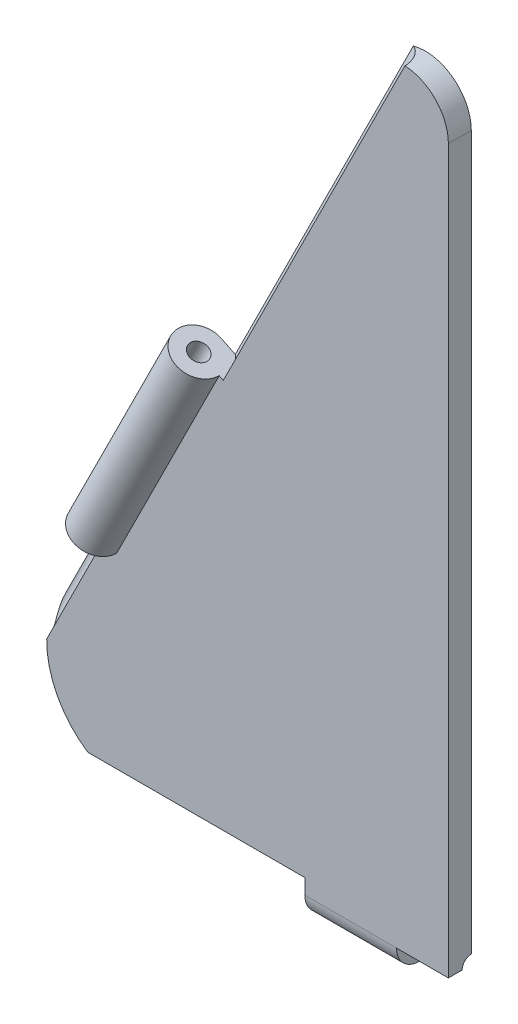
ISO-10303-21;
HEADER;
FILE_DESCRIPTION(('STEP AP214'),'2;1');
FILE_NAME('part.step','',(''),(''),'','','');
FILE_SCHEMA(('AUTOMOTIVE_DESIGN { 1 0 10303 214 1 1 1 1 }'));
ENDSEC;
DATA;
#1=APPLICATION_CONTEXT('core data for automotive mechanical design processes');
#2=APPLICATION_PROTOCOL_DEFINITION('international standard','automotive_design',2000,#1);
#3=PRODUCT_CONTEXT('',#1,'mechanical');
#4=PRODUCT('Part','Part','',(#3));
#5=PRODUCT_RELATED_PRODUCT_CATEGORY('part','',(#4));
#6=PRODUCT_DEFINITION_FORMATION('','',#4);
#7=PRODUCT_DEFINITION_CONTEXT('part definition',#1,'design');
#8=PRODUCT_DEFINITION('design','',#6,#7);
#9=PRODUCT_DEFINITION_SHAPE('','',#8);
#10=(LENGTH_UNIT() NAMED_UNIT(*) SI_UNIT(.MILLI.,.METRE.));
#11=(NAMED_UNIT(*) PLANE_ANGLE_UNIT() SI_UNIT($,.RADIAN.));
#12=(NAMED_UNIT(*) SI_UNIT($,.STERADIAN.) SOLID_ANGLE_UNIT());
#13=UNCERTAINTY_MEASURE_WITH_UNIT(LENGTH_MEASURE(1.E-05),#10,'distance_accuracy_value','');
#14=(GEOMETRIC_REPRESENTATION_CONTEXT(3) GLOBAL_UNCERTAINTY_ASSIGNED_CONTEXT((#13)) GLOBAL_UNIT_ASSIGNED_CONTEXT((#10,
#11,#12)) REPRESENTATION_CONTEXT('',''));
#15=CARTESIAN_POINT('',(0.,0.,0.));
#16=DIRECTION('',(0.,0.,1.));
#17=DIRECTION('',(1.,0.,0.));
#18=AXIS2_PLACEMENT_3D('',#15,#16,#17);
#19=CARTESIAN_POINT('',(-289.97718898323,96.6564322064938,2.5));
#20=DIRECTION('',(0.,0.,-1.));
#21=DIRECTION('',(-1.,0.,0.));
#22=AXIS2_PLACEMENT_3D('',#19,#20,#21);
#23=PLANE('',#22);
#24=DIRECTION('',(0.894427190999916,-0.447213595499958,0.));
#25=VECTOR('',#24,1.);
#26=CARTESIAN_POINT('',(-274.449324938229,127.712160296495,2.5));
#27=LINE('',#26,#25);
#28=CARTESIAN_POINT('',(-283.393596848228,132.184296251494,2.5));
#29=VERTEX_POINT('',#28);
#30=CARTESIAN_POINT('',(-281.910357150809,131.442676402785,2.5));
#31=VERTEX_POINT('',#30);
#32=EDGE_CURVE('E164',#29,#31,#27,.T.);
#33=ORIENTED_EDGE('',*,*,#32,.T.);
#34=DIRECTION('',(-0.447213595499958,-0.894427190999916,0.));
#35=VECTOR('',#34,1.);
#36=CARTESIAN_POINT('',(-261.146425128309,172.970540447785,2.5));
#37=LINE('',#36,#35);
#38=CARTESIAN_POINT('',(-262.483107723135,170.297175258133,2.5));
#39=VERTEX_POINT('',#38);
#40=EDGE_CURVE('E170',#31,#39,#37,.F.);
#41=ORIENTED_EDGE('',*,*,#40,.T.);
#42=CARTESIAN_POINT('',(-261.157528870729,165.476092318995,2.5));
#43=DIRECTION('',(0.,0.,1.));
#44=DIRECTION('',(1.,0.,0.));
#45=AXIS2_PLACEMENT_3D('',#42,#43,#44);
#46=CIRCLE('',#45,5.00000000000001);
#47=CARTESIAN_POINT('',(-256.157528870729,165.476092318995,2.5));
#48=VERTEX_POINT('',#47);
#49=EDGE_CURVE('E270',#48,#39,#46,.T.);
#50=ORIENTED_EDGE('',*,*,#49,.F.);
#51=DIRECTION('',(0.,1.,0.));
#52=VECTOR('',#51,1.);
#53=CARTESIAN_POINT('',(-256.157528870729,86.6564322064939,2.5));
#54=LINE('',#53,#52);
#55=CARTESIAN_POINT('',(-256.157528870729,87.6564322064939,2.5));
#56=VERTEX_POINT('',#55);
#57=EDGE_CURVE('E268',#56,#48,#54,.T.);
#58=ORIENTED_EDGE('',*,*,#57,.F.);
#59=DIRECTION('',(-1.,0.,0.));
#60=VECTOR('',#59,1.);
#61=CARTESIAN_POINT('',(-256.157528870729,87.6564322064939,2.5));
#62=LINE('',#61,#60);
#63=CARTESIAN_POINT('',(-261.817358926979,87.6564322064939,2.5));
#64=VERTEX_POINT('',#63);
#65=EDGE_CURVE('E184',#64,#56,#62,.F.);
#66=ORIENTED_EDGE('',*,*,#65,.F.);
#67=DIRECTION('',(0.,1.,0.));
#68=VECTOR('',#67,1.);
#69=CARTESIAN_POINT('',(-261.817358926979,96.6564322064938,2.5));
#70=LINE('',#69,#68);
#71=CARTESIAN_POINT('',(-261.817358926979,89.1564322064939,2.5));
#72=VERTEX_POINT('',#71);
#73=EDGE_CURVE('E283',#64,#72,#70,.T.);
#74=ORIENTED_EDGE('',*,*,#73,.T.);
#75=DIRECTION('',(-1.,0.,0.));
#76=VECTOR('',#75,1.);
#77=CARTESIAN_POINT('',(-271.817358926979,89.1564322064939,2.5));
#78=LINE('',#77,#76);
#79=CARTESIAN_POINT('',(-271.817358926979,89.1564322064939,2.5));
#80=VERTEX_POINT('',#79);
#81=EDGE_CURVE('E285',#72,#80,#78,.T.);
#82=ORIENTED_EDGE('',*,*,#81,.T.);
#83=DIRECTION('',(0.,1.,0.));
#84=VECTOR('',#83,1.);
#85=CARTESIAN_POINT('',(-271.817358926979,96.6564322064938,2.5));
#86=LINE('',#85,#84);
#87=CARTESIAN_POINT('',(-271.817358926979,89.6564322064939,2.5));
#88=VERTEX_POINT('',#87);
#89=EDGE_CURVE('E192',#80,#88,#86,.T.);
#90=ORIENTED_EDGE('',*,*,#89,.T.);
#91=DIRECTION('',(1.,0.,0.));
#92=VECTOR('',#91,1.);
#93=CARTESIAN_POINT('',(-299.97718898323,89.6564322064939,2.5));
#94=LINE('',#93,#92);
#95=CARTESIAN_POINT('',(-297.118617411773,89.6564322064939,2.5));
#96=VERTEX_POINT('',#95);
#97=EDGE_CURVE('E202',#88,#96,#94,.F.);
#98=ORIENTED_EDGE('',*,*,#97,.T.);
#99=CARTESIAN_POINT('',(-289.97718898323,96.6564322064938,2.5));
#100=DIRECTION('',(0.,0.,1.));
#101=DIRECTION('',(-1.,0.,0.));
#102=AXIS2_PLACEMENT_3D('',#99,#100,#101);
#103=CIRCLE('',#102,9.99999999999999);
#104=CARTESIAN_POINT('',(-298.921460893229,101.128568161494,2.5));
#105=VERTEX_POINT('',#104);
#106=EDGE_CURVE('E255',#105,#96,#103,.T.);
#107=ORIENTED_EDGE('',*,*,#106,.F.);
#108=DIRECTION('',(-0.447213595499957,-0.894427190999916,0.));
#109=VECTOR('',#108,1.);
#110=CARTESIAN_POINT('',(-265.629664825728,167.712160296494,2.5));
#111=LINE('',#110,#109);
#112=CARTESIAN_POINT('',(-294.573936735728,109.823616476496,2.5));
#113=VERTEX_POINT('',#112);
#114=EDGE_CURVE('E273',#113,#105,#111,.T.);
#115=ORIENTED_EDGE('',*,*,#114,.F.);
#116=EDGE_CURVE('E260',#29,#113,#111,.T.);
#117=ORIENTED_EDGE('',*,*,#116,.F.);
#118=EDGE_LOOP('',(#33,#41,#50,#58,#66,#74,#82,#90,#98,#107,#115,#117));
#119=FACE_BOUND('',#118,.T.);
#120=ADVANCED_FACE('F45',(#119),#23,.T.);
#121=CARTESIAN_POINT('',(-289.97718898323,96.6564322064938,5.));
#122=DIRECTION('',(0.,0.,-1.));
#123=DIRECTION('',(-1.,0.,0.));
#124=AXIS2_PLACEMENT_3D('',#121,#122,#123);
#125=PLANE('',#124);
#126=DIRECTION('',(-0.447213595499958,-0.894427190999916,0.));
#127=VECTOR('',#126,1.);
#128=CARTESIAN_POINT('',(-259.946383252728,172.370519509995,5.));
#129=LINE('',#128,#127);
#130=CARTESIAN_POINT('',(-280.710315275229,130.842655464994,5.));
#131=VERTEX_POINT('',#130);
#132=CARTESIAN_POINT('',(-260.896993099537,170.469299816379,5.));
#133=VERTEX_POINT('',#132);
#134=EDGE_CURVE('E163',#131,#133,#129,.F.);
#135=ORIENTED_EDGE('',*,*,#134,.F.);
#136=DIRECTION('',(0.894427190999916,-0.447213595499958,0.));
#137=VECTOR('',#136,1.);
#138=CARTESIAN_POINT('',(-274.449324938229,127.712160296495,5.));
#139=LINE('',#138,#137);
#140=CARTESIAN_POINT('',(-281.157528870729,131.066262262744,5.));
#141=VERTEX_POINT('',#140);
#142=EDGE_CURVE('E152',#141,#131,#139,.T.);
#143=ORIENTED_EDGE('',*,*,#142,.F.);
#144=DIRECTION('',(0.447213595499958,0.894427190999916,0.));
#145=VECTOR('',#144,1.);
#146=CARTESIAN_POINT('',(-281.157528870729,131.066262262744,5.));
#147=LINE('',#146,#145);
#148=CARTESIAN_POINT('',(-292.337868758228,108.705582487746,5.));
#149=VERTEX_POINT('',#148);
#150=EDGE_CURVE('E253',#141,#149,#147,.F.);
#151=ORIENTED_EDGE('',*,*,#150,.T.);
#152=DIRECTION('',(-0.894427190999916,0.447213595499958,0.));
#153=VECTOR('',#152,1.);
#154=CARTESIAN_POINT('',(-285.629664825728,105.351480521497,5.));
#155=LINE('',#154,#153);
#156=CARTESIAN_POINT('',(-293.679509544727,109.376402880996,5.));
#157=VERTEX_POINT('',#156);
#158=EDGE_CURVE('E248',#149,#157,#155,.T.);
#159=ORIENTED_EDGE('',*,*,#158,.T.);
#160=DIRECTION('',(-0.447213595499958,-0.894427190999916,0.));
#161=VECTOR('',#160,1.);
#162=CARTESIAN_POINT('',(-261.735237634728,173.264946700995,5.));
#163=LINE('',#162,#161);
#164=CARTESIAN_POINT('',(-299.976392571191,96.7826368280699,5.));
#165=VERTEX_POINT('',#164);
#166=EDGE_CURVE('E229',#157,#165,#163,.T.);
#167=ORIENTED_EDGE('',*,*,#166,.T.);
#168=CARTESIAN_POINT('',(-289.97718898323,96.6564322064938,5.));
#169=DIRECTION('',(0.,0.,1.));
#170=DIRECTION('',(-1.,0.,0.));
#171=AXIS2_PLACEMENT_3D('',#168,#169,#170);
#172=CIRCLE('',#171,9.99999999999999);
#173=CARTESIAN_POINT('',(-295.492281720759,88.3147446016716,5.));
#174=VERTEX_POINT('',#173);
#175=EDGE_CURVE('E256',#165,#174,#172,.T.);
#176=ORIENTED_EDGE('',*,*,#175,.T.);
#177=DIRECTION('',(1.,0.,0.));
#178=VECTOR('',#177,1.);
#179=CARTESIAN_POINT('',(-299.97718898323,88.3147446016716,5.));
#180=LINE('',#179,#178);
#181=CARTESIAN_POINT('',(-271.817358926979,88.3147446016716,5.));
#182=VERTEX_POINT('',#181);
#183=EDGE_CURVE('E291',#182,#174,#180,.F.);
#184=ORIENTED_EDGE('',*,*,#183,.F.);
#185=DIRECTION('',(0.,1.,0.));
#186=VECTOR('',#185,1.);
#187=CARTESIAN_POINT('',(-271.817358926979,96.6564322064938,5.));
#188=LINE('',#187,#186);
#189=CARTESIAN_POINT('',(-271.817358926979,86.6564322064939,5.));
#190=VERTEX_POINT('',#189);
#191=EDGE_CURVE('E190',#190,#182,#188,.T.);
#192=ORIENTED_EDGE('',*,*,#191,.F.);
#193=DIRECTION('',(-1.,0.,0.));
#194=VECTOR('',#193,1.);
#195=CARTESIAN_POINT('',(-271.817358926979,86.6564322064939,5.));
#196=LINE('',#195,#194);
#197=CARTESIAN_POINT('',(-261.817358926979,86.6564322064939,5.));
#198=VERTEX_POINT('',#197);
#199=EDGE_CURVE('E241',#190,#198,#196,.F.);
#200=ORIENTED_EDGE('',*,*,#199,.T.);
#201=DIRECTION('',(1.,0.,0.));
#202=VECTOR('',#201,1.);
#203=CARTESIAN_POINT('',(-289.97718898323,86.6564322064939,5.));
#204=LINE('',#203,#202);
#205=CARTESIAN_POINT('',(-256.157528870729,86.6564322064939,5.));
#206=VERTEX_POINT('',#205);
#207=EDGE_CURVE('E259',#198,#206,#204,.T.);
#208=ORIENTED_EDGE('',*,*,#207,.T.);
#209=DIRECTION('',(0.,1.,0.));
#210=VECTOR('',#209,1.);
#211=CARTESIAN_POINT('',(-256.157528870729,86.6564322064939,5.));
#212=LINE('',#211,#210);
#213=CARTESIAN_POINT('',(-256.157528870729,165.476092318995,5.));
#214=VERTEX_POINT('',#213);
#215=EDGE_CURVE('E262',#206,#214,#212,.T.);
#216=ORIENTED_EDGE('',*,*,#215,.T.);
#217=CARTESIAN_POINT('',(-261.157528870729,165.476092318995,5.));
#218=DIRECTION('',(0.,0.,1.));
#219=DIRECTION('',(1.,0.,0.));
#220=AXIS2_PLACEMENT_3D('',#217,#218,#219);
#221=CIRCLE('',#220,5.00000000000001);
#222=EDGE_CURVE('E175',#214,#133,#221,.T.);
#223=ORIENTED_EDGE('',*,*,#222,.T.);
#224=EDGE_LOOP('',(#135,#143,#151,#159,#167,#176,#184,#192,#200,#208,#216,#223));
#225=FACE_BOUND('',#224,.T.);
#226=ADVANCED_FACE('F173',(#225),#125,.F.);
#227=CARTESIAN_POINT('',(-261.157528870729,165.476092318995,5.));
#228=DIRECTION('',(0.,0.,-1.));
#229=DIRECTION('',(-1.,0.,0.));
#230=AXIS2_PLACEMENT_3D('',#227,#228,#229);
#231=CYLINDRICAL_SURFACE('',#230,5.00000000000001);
#232=CARTESIAN_POINT('',(-260.896993099537,170.469299816379,5.));
#233=CARTESIAN_POINT('',(-260.896988347755,170.469286635421,4.9233913880761));
#234=CARTESIAN_POINT('',(-260.900190551412,170.46946630684,4.84678521462993));
#235=CARTESIAN_POINT('',(-260.912971757577,170.47011543886,4.69410614682717));
#236=CARTESIAN_POINT('',(-260.922550910404,170.47058490629,4.61803326508406));
#237=CARTESIAN_POINT('',(-260.948051018156,170.471717800458,4.46694029175455));
#238=CARTESIAN_POINT('',(-260.963973026661,170.472381259412,4.39192037721535));
#239=CARTESIAN_POINT('',(-261.002057833009,170.473710534316,4.24350558058141));
#240=CARTESIAN_POINT('',(-261.024220441306,170.474376350194,4.17011064920393));
#241=CARTESIAN_POINT('',(-261.099962032676,170.476020678725,3.95301129216209));
#242=CARTESIAN_POINT('',(-261.162793256986,170.476645951899,3.81240133931156));
#243=CARTESIAN_POINT('',(-261.31124386419,170.474274888097,3.54402419807906));
#244=CARTESIAN_POINT('',(-261.396845362707,170.471281386889,3.41624703851447));
#245=CARTESIAN_POINT('',(-261.586719492906,170.45853323552,3.17831278954411));
#246=CARTESIAN_POINT('',(-261.690756420873,170.448859927149,3.0679631344423));
#247=CARTESIAN_POINT('',(-261.914032257995,170.419805646467,2.86541751663317));
#248=CARTESIAN_POINT('',(-262.033267284906,170.400427149586,2.77321693312596));
#249=CARTESIAN_POINT('',(-262.21022064098,170.364320157933,2.6553629856596));
#250=CARTESIAN_POINT('',(-262.263921374375,170.352466514842,2.62191188166515));
#251=CARTESIAN_POINT('',(-262.372610056761,170.326524378497,2.55843875952877));
#252=CARTESIAN_POINT('',(-262.42759458521,170.312441349644,2.52840865794112));
#253=CARTESIAN_POINT('',(-262.483107723135,170.297175258133,2.5));
#254=B_SPLINE_CURVE_WITH_KNOTS('',3,(#232,#233,#234,#235,#236,#237,#238,#239,#240,#241,#242,
#243,#244,#245,#246,#247,#248,#249,#250,#251,#252,#253),.UNSPECIFIED.,.F.,.F.,(4,2,2,2,2,2,2,2,
2,2,4),(0.,0.22975409222768,0.459513600419766,0.68931128870851,0.919101998082991,1.378710562228,
1.83795919808724,2.29171184256308,2.74534881060817,2.9383389628852,3.1308632035463),.UNSPECIFIED.);
#255=EDGE_CURVE('E12',#133,#39,#254,.T.);
#256=ORIENTED_EDGE('',*,*,#255,.F.);
#257=ORIENTED_EDGE('',*,*,#222,.F.);
#258=DIRECTION('',(0.,0.,-1.));
#259=VECTOR('',#258,1.);
#260=CARTESIAN_POINT('',(-256.157528870729,165.476092318995,5.));
#261=LINE('',#260,#259);
#262=EDGE_CURVE('E277',#214,#48,#261,.T.);
#263=ORIENTED_EDGE('',*,*,#262,.T.);
#264=ORIENTED_EDGE('',*,*,#49,.T.);
#265=EDGE_LOOP('',(#256,#257,#263,#264));
#266=FACE_BOUND('',#265,.T.);
#267=ADVANCED_FACE('F215',(#266),#231,.T.);
#268=CARTESIAN_POINT('',(-262.629664825728,173.712160296495,4.99999999999999));
#269=DIRECTION('',(-0.447213595499958,-0.894427190999916,0.));
#270=DIRECTION('',(0.894427190999916,-0.447213595499958,0.));
#271=AXIS2_PLACEMENT_3D('',#268,#269,#270);
#272=CYLINDRICAL_SURFACE('',#271,1.);
#273=CARTESIAN_POINT('',(-299.976392571191,96.7826368280699,5.));
#274=CARTESIAN_POINT('',(-299.976390483361,96.7825710563107,4.97340569328912));
#275=CARTESIAN_POINT('',(-299.976362008091,96.7850669164074,4.9468941799335));
#276=CARTESIAN_POINT('',(-299.976236556925,96.7945793833969,4.89497835142418));
#277=CARTESIAN_POINT('',(-299.976140322486,96.8015469856599,4.86956518376658));
#278=CARTESIAN_POINT('',(-299.975834151883,96.8213738311701,4.81479787758699));
#279=CARTESIAN_POINT('',(-299.975603984182,96.8351870398518,4.7857941367651));
#280=CARTESIAN_POINT('',(-299.974977503782,96.8673499883272,4.7303360167709));
#281=CARTESIAN_POINT('',(-299.974580464437,96.8857194231713,4.70389341740598));
#282=CARTESIAN_POINT('',(-299.97331333722,96.9364888657939,4.64028187448));
#283=CARTESIAN_POINT('',(-299.972303844597,96.9711413302242,4.60493070052432));
#284=CARTESIAN_POINT('',(-299.96969680239,97.0452425348733,4.53980000343431));
#285=CARTESIAN_POINT('',(-299.968098144125,97.0847002231327,4.51003114538899));
#286=CARTESIAN_POINT('',(-299.9643475153,97.1645483771898,4.45652805035983));
#287=CARTESIAN_POINT('',(-299.96222789657,97.2047888162956,4.43256358204837));
#288=CARTESIAN_POINT('',(-299.957366194407,97.2871197474709,4.38808912985786));
#289=CARTESIAN_POINT('',(-299.954623531492,97.3292119322414,4.36758239308767));
#290=CARTESIAN_POINT('',(-299.948489411164,97.4147265046999,4.32943621821867));
#291=CARTESIAN_POINT('',(-299.945096543016,97.4581516091027,4.31180317192067));
#292=CARTESIAN_POINT('',(-299.937655202848,97.5458421625752,4.27901209995677));
#293=CARTESIAN_POINT('',(-299.933606973179,97.5901072956807,4.26385316350999));
#294=CARTESIAN_POINT('',(-299.922915338052,97.6988737726317,4.22941267040974));
#295=CARTESIAN_POINT('',(-299.91591447105,97.7636962059699,4.21125838544163));
#296=CARTESIAN_POINT('',(-299.900523837879,97.8940688363546,4.17845580954913));
#297=CARTESIAN_POINT('',(-299.892133430208,97.9596193564319,4.16380914564493));
#298=CARTESIAN_POINT('',(-299.864849452458,98.1570348663027,4.12410158666935));
#299=CARTESIAN_POINT('',(-299.84386145561,98.2894748355457,4.10332815341354));
#300=CARTESIAN_POINT('',(-299.796204956827,98.5551981579176,4.06942023386373));
#301=CARTESIAN_POINT('',(-299.769497338611,98.6884808529705,4.05634079945788));
#302=CARTESIAN_POINT('',(-299.710592336995,98.9541159150663,4.0355788109571));
#303=CARTESIAN_POINT('',(-299.67839947432,99.0864689555082,4.02789183908708));
#304=CARTESIAN_POINT('',(-299.599413474249,99.3845098904612,4.01453099930194));
#305=CARTESIAN_POINT('',(-299.551006889323,99.5498151603501,4.00991743694544));
#306=CARTESIAN_POINT('',(-299.445681718677,99.8778187036756,4.00375184803353));
#307=CARTESIAN_POINT('',(-299.388759444816,100.040515813549,4.00220115215746));
#308=CARTESIAN_POINT('',(-299.297756033539,100.280539823007,4.00087674346802));
#309=CARTESIAN_POINT('',(-299.266836215579,100.359076993048,4.00060007862499));
#310=CARTESIAN_POINT('',(-299.203017293267,100.515345820115,4.00023021068289));
#311=CARTESIAN_POINT('',(-299.170118187459,100.593077476548,4.00013700771872));
#312=CARTESIAN_POINT('',(-299.102383712655,100.747634440845,4.00002695853791));
#313=CARTESIAN_POINT('',(-299.067549558168,100.82446028133,4.00001006496274));
#314=CARTESIAN_POINT('',(-298.995948903675,100.977205865924,4.0000001836287));
#315=CARTESIAN_POINT('',(-298.959182409839,101.053125612924,4.00000719579349));
#316=CARTESIAN_POINT('',(-298.921460893229,101.128568161494,4.));
#317=B_SPLINE_CURVE_WITH_KNOTS('',3,(#273,#274,#275,#276,#277,#278,#279,#280,#281,#282,#283,
#284,#285,#286,#287,#288,#289,#290,#291,#292,#293,#294,#295,#296,#297,#298,#299,#300,#301,#302,
#303,#304,#305,#306,#307,#308,#309,#310,#311,#312,#313,#314,#315,#316),.UNSPECIFIED.,.F.,.F.,(4,
2,2,2,2,2,2,2,2,2,2,2,2,2,2,2,2,2,2,2,2,4),(0.,0.0795320827412105,0.158207141014473,
0.25405311422705,0.350320847440173,0.498025061239138,0.64600865323595,0.786450289747306,
0.927023087303415,1.06790440784301,1.20873374894345,1.41162650416818,1.61461319028629,
2.02117689925323,2.4306153301292,2.83971793558578,3.35635771232905,3.87322189676165,
4.12641469134452,4.37960767211051,4.63264349660361,4.88567851305877),.UNSPECIFIED.);
#318=CARTESIAN_POINT('',(-298.921460893229,101.128568161494,4.));
#319=VERTEX_POINT('',#318);
#320=EDGE_CURVE('E220',#165,#319,#317,.T.);
#321=ORIENTED_EDGE('',*,*,#320,.F.);
#322=ORIENTED_EDGE('',*,*,#166,.F.);
#323=CARTESIAN_POINT('',(-294.573936735727,109.823616476496,5.));
#324=DIRECTION('',(-0.447213595499958,-0.894427190999916,0.));
#325=DIRECTION('',(0.894427190999916,-0.447213595499958,0.));
#326=AXIS2_PLACEMENT_3D('',#323,#324,#325);
#327=CIRCLE('',#326,1.);
#328=CARTESIAN_POINT('',(-294.573936735727,109.823616476496,3.99999999999999));
#329=VERTEX_POINT('',#328);
#330=EDGE_CURVE('E230',#157,#329,#327,.T.);
#331=ORIENTED_EDGE('',*,*,#330,.T.);
#332=DIRECTION('',(-0.447213595499958,-0.894427190999916,0.));
#333=VECTOR('',#332,1.);
#334=CARTESIAN_POINT('',(-262.629664825728,173.712160296495,3.99999999999999));
#335=LINE('',#334,#333);
#336=EDGE_CURVE('E228',#319,#329,#335,.F.);
#337=ORIENTED_EDGE('',*,*,#336,.F.);
#338=EDGE_LOOP('',(#321,#322,#331,#337));
#339=FACE_BOUND('',#338,.T.);
#340=CARTESIAN_POINT('',(-283.393596848228,132.184296251494,4.99999999999999));
#341=DIRECTION('',(0.447213595499958,0.894427190999916,0.));
#342=DIRECTION('',(-0.894427190999916,0.447213595499958,0.));
#343=AXIS2_PLACEMENT_3D('',#340,#341,#342);
#344=CIRCLE('',#343,1.);
#345=CARTESIAN_POINT('',(-284.288024039228,132.631509846994,4.99999999999999));
#346=VERTEX_POINT('',#345);
#347=EDGE_CURVE('E288',#346,#346,#344,.T.);
#348=ORIENTED_EDGE('',*,*,#347,.T.);
#349=EDGE_LOOP('',(#348));
#350=FACE_BOUND('',#349,.T.);
#351=ADVANCED_FACE('F211',(#339,#350),#272,.F.);
#352=CARTESIAN_POINT('',(-289.97718898323,96.6564322064938,5.));
#353=DIRECTION('',(0.,0.,-1.));
#354=DIRECTION('',(-1.,0.,0.));
#355=AXIS2_PLACEMENT_3D('',#352,#353,#354);
#356=CYLINDRICAL_SURFACE('',#355,9.99999999999999);
#357=CARTESIAN_POINT('',(-295.492281720759,88.3147446016716,5.));
#358=CARTESIAN_POINT('',(-295.573150045764,88.36819228831,4.96453259179495));
#359=CARTESIAN_POINT('',(-295.652395022861,88.4222926585283,4.92618978086043));
#360=CARTESIAN_POINT('',(-295.80723009037,88.531192555033,4.84307434507064));
#361=CARTESIAN_POINT('',(-295.882811849442,88.5859933468766,4.79828790566233));
#362=CARTESIAN_POINT('',(-296.030255352811,88.6959711292309,4.70129485356435));
#363=CARTESIAN_POINT('',(-296.10207471479,88.7511467192802,4.64902150998615));
#364=CARTESIAN_POINT('',(-296.240416544785,88.8602958144,4.5369343121481));
#365=CARTESIAN_POINT('',(-296.306943819879,88.914270377563,4.47712743159639));
#366=CARTESIAN_POINT('',(-296.462447498133,89.0435699137055,4.32097329208557));
#367=CARTESIAN_POINT('',(-296.548157508277,89.117647809148,4.22024628090868));
#368=CARTESIAN_POINT('',(-296.70410860978,89.2564693138911,4.00213196963507));
#369=CARTESIAN_POINT('',(-296.774398270533,89.321242002594,3.88479895188816));
#370=CARTESIAN_POINT('',(-296.866745678528,89.4082709537481,3.69676832297514));
#371=CARTESIAN_POINT('',(-296.895478891693,89.4357255975793,3.63165941407934));
#372=CARTESIAN_POINT('',(-296.948065962715,89.486480624561,3.49796132205243));
#373=CARTESIAN_POINT('',(-296.971922455996,89.5097832506222,3.42937404381141));
#374=CARTESIAN_POINT('',(-297.014465025995,89.5516703917974,3.289265497155));
#375=CARTESIAN_POINT('',(-297.033154267858,89.5702577945937,3.21774605577535));
#376=CARTESIAN_POINT('',(-297.06514298377,89.6022548808244,3.0724175936042));
#377=CARTESIAN_POINT('',(-297.078445663398,89.6156676434972,2.99860996277014));
#378=CARTESIAN_POINT('',(-297.098820218481,89.6362772151664,2.85423716875693));
#379=CARTESIAN_POINT('',(-297.106238732045,89.6438192458372,2.78377005497531));
#380=CARTESIAN_POINT('',(-297.116139804126,89.6539047888962,2.64220558671));
#381=CARTESIAN_POINT('',(-297.118627150958,89.6564531502623,2.5711089110184));
#382=CARTESIAN_POINT('',(-297.118617411773,89.6564322064939,2.5));
#383=B_SPLINE_CURVE_WITH_KNOTS('',3,(#357,#358,#359,#360,#361,#362,#363,#364,#365,#366,#367,
#368,#369,#370,#371,#372,#373,#374,#375,#376,#377,#378,#379,#380,#381,#382),.UNSPECIFIED.,.F.,
.F.,(4,2,2,2,2,2,2,2,2,2,2,2,4),(0.,0.309684411861199,0.620042935844867,0.93336315564977,
1.24639544111468,1.69942418751536,2.15100486557514,2.37954958211171,2.60797046250319,
2.83625111452378,3.06439571480573,3.27782025255503,3.49103744683235),.UNSPECIFIED.);
#384=EDGE_CURVE('E195',#174,#96,#383,.T.);
#385=ORIENTED_EDGE('',*,*,#384,.F.);
#386=ORIENTED_EDGE('',*,*,#175,.F.);
#387=ORIENTED_EDGE('',*,*,#320,.T.);
#388=DIRECTION('',(0.,0.,-1.));
#389=VECTOR('',#388,1.);
#390=CARTESIAN_POINT('',(-298.921460893229,101.128568161494,5.));
#391=LINE('',#390,#389);
#392=EDGE_CURVE('E265',#319,#105,#391,.T.);
#393=ORIENTED_EDGE('',*,*,#392,.T.);
#394=ORIENTED_EDGE('',*,*,#106,.T.);
#395=EDGE_LOOP('',(#385,#386,#387,#393,#394));
#396=FACE_BOUND('',#395,.T.);
#397=ADVANCED_FACE('F47',(#396),#356,.T.);
#398=CARTESIAN_POINT('',(-289.97718898323,86.6564322064939,5.));
#399=DIRECTION('',(0.,1.,0.));
#400=DIRECTION('',(0.,0.,1.));
#401=AXIS2_PLACEMENT_3D('',#398,#399,#400);
#402=PLANE('',#401);
#403=DIRECTION('',(0.,0.,1.));
#404=VECTOR('',#403,1.);
#405=CARTESIAN_POINT('',(-261.817358926979,86.6564322064939,5.));
#406=LINE('',#405,#404);
#407=CARTESIAN_POINT('',(-261.817358926979,86.6564322064939,3.5));
#408=VERTEX_POINT('',#407);
#409=EDGE_CURVE('E239',#408,#198,#406,.T.);
#410=ORIENTED_EDGE('',*,*,#409,.F.);
#411=DIRECTION('',(-1.,0.,0.));
#412=VECTOR('',#411,1.);
#413=CARTESIAN_POINT('',(-256.157528870729,86.6564322064939,3.5));
#414=LINE('',#413,#412);
#415=CARTESIAN_POINT('',(-256.157528870729,86.6564322064939,3.5));
#416=VERTEX_POINT('',#415);
#417=EDGE_CURVE('E67',#408,#416,#414,.F.);
#418=ORIENTED_EDGE('',*,*,#417,.T.);
#419=DIRECTION('',(0.,0.,-1.));
#420=VECTOR('',#419,1.);
#421=CARTESIAN_POINT('',(-256.157528870729,86.6564322064939,5.));
#422=LINE('',#421,#420);
#423=EDGE_CURVE('E280',#206,#416,#422,.T.);
#424=ORIENTED_EDGE('',*,*,#423,.F.);
#425=ORIENTED_EDGE('',*,*,#207,.F.);
#426=EDGE_LOOP('',(#410,#418,#424,#425));
#427=FACE_BOUND('',#426,.T.);
#428=ADVANCED_FACE('F299',(#427),#402,.F.);
#429=CARTESIAN_POINT('',(-265.629664825728,167.712160296494,5.));
#430=DIRECTION('',(0.894427190999916,-0.447213595499957,0.));
#431=DIRECTION('',(0.447213595499958,0.894427190999916,0.));
#432=AXIS2_PLACEMENT_3D('',#429,#430,#431);
#433=PLANE('',#432);
#434=ORIENTED_EDGE('',*,*,#392,.F.);
#435=ORIENTED_EDGE('',*,*,#336,.T.);
#436=DIRECTION('',(0.,0.,-1.));
#437=VECTOR('',#436,1.);
#438=CARTESIAN_POINT('',(-294.573936735727,109.823616476496,5.00000000000001));
#439=LINE('',#438,#437);
#440=EDGE_CURVE('E251',#329,#113,#439,.T.);
#441=ORIENTED_EDGE('',*,*,#440,.T.);
#442=ORIENTED_EDGE('',*,*,#114,.T.);
#443=EDGE_LOOP('',(#434,#435,#441,#442));
#444=FACE_BOUND('',#443,.T.);
#445=ADVANCED_FACE('F336',(#444),#433,.F.);
#446=CARTESIAN_POINT('',(-256.157528870729,86.6564322064939,5.));
#447=DIRECTION('',(-1.,0.,0.));
#448=DIRECTION('',(0.,0.,1.));
#449=AXIS2_PLACEMENT_3D('',#446,#447,#448);
#450=PLANE('',#449);
#451=ORIENTED_EDGE('',*,*,#423,.T.);
#452=CARTESIAN_POINT('',(-256.157528870729,86.6564322064939,2.5));
#453=DIRECTION('',(-1.,0.,0.));
#454=DIRECTION('',(0.,0.,1.));
#455=AXIS2_PLACEMENT_3D('',#452,#453,#454);
#456=CIRCLE('',#455,1.);
#457=EDGE_CURVE('E177',#416,#56,#456,.T.);
#458=ORIENTED_EDGE('',*,*,#457,.T.);
#459=ORIENTED_EDGE('',*,*,#57,.T.);
#460=ORIENTED_EDGE('',*,*,#262,.F.);
#461=ORIENTED_EDGE('',*,*,#215,.F.);
#462=EDGE_LOOP('',(#451,#458,#459,#460,#461));
#463=FACE_BOUND('',#462,.T.);
#464=ADVANCED_FACE('F316',(#463),#450,.F.);
#465=CARTESIAN_POINT('',(-283.393596848229,132.184296251494,5.));
#466=DIRECTION('',(0.447213595499958,0.894427190999916,0.));
#467=DIRECTION('',(-0.894427190999916,0.447213595499958,0.));
#468=AXIS2_PLACEMENT_3D('',#465,#466,#467);
#469=CYLINDRICAL_SURFACE('',#468,2.5);
#470=ORIENTED_EDGE('',*,*,#150,.F.);
#471=CARTESIAN_POINT('',(-283.393596848229,132.184296251494,5.));
#472=DIRECTION('',(0.447213595499958,0.894427190999916,0.));
#473=DIRECTION('',(-0.894427190999916,0.447213595499958,0.));
#474=AXIS2_PLACEMENT_3D('',#471,#472,#473);
#475=CIRCLE('',#474,2.5);
#476=EDGE_CURVE('E159',#29,#141,#475,.T.);
#477=ORIENTED_EDGE('',*,*,#476,.F.);
#478=ORIENTED_EDGE('',*,*,#116,.T.);
#479=CARTESIAN_POINT('',(-294.573936735728,109.823616476496,5.));
#480=DIRECTION('',(0.447213595499958,0.894427190999916,0.));
#481=DIRECTION('',(-0.894427190999916,0.447213595499958,0.));
#482=AXIS2_PLACEMENT_3D('',#479,#480,#481);
#483=CIRCLE('',#482,2.5);
#484=EDGE_CURVE('E245',#113,#149,#483,.T.);
#485=ORIENTED_EDGE('',*,*,#484,.T.);
#486=EDGE_LOOP('',(#470,#477,#478,#485));
#487=FACE_BOUND('',#486,.T.);
#488=ADVANCED_FACE('F324',(#487),#469,.T.);
#489=CARTESIAN_POINT('',(-294.573936735728,109.823616476496,2.5));
#490=DIRECTION('',(-0.447213595499958,-0.894427190999916,0.));
#491=DIRECTION('',(0.894427190999916,-0.447213595499958,0.));
#492=AXIS2_PLACEMENT_3D('',#489,#490,#491);
#493=PLANE('',#492);
#494=ORIENTED_EDGE('',*,*,#330,.F.);
#495=ORIENTED_EDGE('',*,*,#158,.F.);
#496=ORIENTED_EDGE('',*,*,#484,.F.);
#497=ORIENTED_EDGE('',*,*,#440,.F.);
#498=EDGE_LOOP('',(#494,#495,#496,#497));
#499=FACE_BOUND('',#498,.T.);
#500=ADVANCED_FACE('F329',(#499),#493,.T.);
#501=CARTESIAN_POINT('',(-283.393596848229,132.184296251494,2.5));
#502=DIRECTION('',(0.447213595499958,0.894427190999916,0.));
#503=DIRECTION('',(-0.894427190999916,0.447213595499958,0.));
#504=AXIS2_PLACEMENT_3D('',#501,#502,#503);
#505=PLANE('',#504);
#506=ORIENTED_EDGE('',*,*,#476,.T.);
#507=ORIENTED_EDGE('',*,*,#142,.T.);
#508=CARTESIAN_POINT('',(-283.393596848229,132.184296251494,4.99999999999999));
#509=DIRECTION('',(0.447213595499958,0.894427190999916,0.));
#510=DIRECTION('',(-0.894427190999916,0.447213595499958,0.));
#511=AXIS2_PLACEMENT_3D('',#508,#509,#510);
#512=CIRCLE('',#511,2.99999999999998);
#513=EDGE_CURVE('E156',#131,#31,#512,.T.);
#514=ORIENTED_EDGE('',*,*,#513,.T.);
#515=ORIENTED_EDGE('',*,*,#32,.F.);
#516=EDGE_LOOP('',(#506,#507,#514,#515));
#517=FACE_BOUND('',#516,.T.);
#518=ORIENTED_EDGE('',*,*,#347,.F.);
#519=EDGE_LOOP('',(#518));
#520=FACE_BOUND('',#519,.T.);
#521=ADVANCED_FACE('F154',(#517,#520),#505,.T.);
#522=CARTESIAN_POINT('',(-271.817358926979,86.6564322064939,2.5));
#523=DIRECTION('',(1.,0.,0.));
#524=DIRECTION('',(0.,0.,-1.));
#525=AXIS2_PLACEMENT_3D('',#522,#523,#524);
#526=PLANE('',#525);
#527=CARTESIAN_POINT('',(-271.817358926979,86.6564322064939,2.5));
#528=DIRECTION('',(-1.,0.,0.));
#529=DIRECTION('',(0.,0.,1.));
#530=AXIS2_PLACEMENT_3D('',#527,#528,#529);
#531=CIRCLE('',#530,1.);
#532=CARTESIAN_POINT('',(-271.817358926979,86.6564322064939,3.5));
#533=VERTEX_POINT('',#532);
#534=EDGE_CURVE('E186',#533,#533,#531,.T.);
#535=ORIENTED_EDGE('',*,*,#534,.F.);
#536=EDGE_LOOP('',(#535));
#537=FACE_BOUND('',#536,.T.);
#538=CARTESIAN_POINT('',(-271.817358926979,86.6564322064939,2.5));
#539=DIRECTION('',(-1.,0.,0.));
#540=DIRECTION('',(0.,0.,1.));
#541=AXIS2_PLACEMENT_3D('',#538,#539,#540);
#542=CIRCLE('',#541,2.5);
#543=EDGE_CURVE('E236',#80,#190,#542,.T.);
#544=ORIENTED_EDGE('',*,*,#543,.T.);
#545=ORIENTED_EDGE('',*,*,#191,.T.);
#546=CARTESIAN_POINT('',(-271.817358926979,86.6564322064939,2.5));
#547=DIRECTION('',(-1.,0.,0.));
#548=DIRECTION('',(0.,0.,1.));
#549=AXIS2_PLACEMENT_3D('',#546,#547,#548);
#550=CIRCLE('',#549,3.);
#551=EDGE_CURVE('E75',#182,#88,#550,.T.);
#552=ORIENTED_EDGE('',*,*,#551,.T.);
#553=ORIENTED_EDGE('',*,*,#89,.F.);
#554=EDGE_LOOP('',(#544,#545,#552,#553));
#555=FACE_BOUND('',#554,.T.);
#556=ADVANCED_FACE('F308',(#537,#555),#526,.F.);
#557=CARTESIAN_POINT('',(-261.817358926979,86.6564322064939,2.5));
#558=DIRECTION('',(-1.,0.,0.));
#559=DIRECTION('',(0.,0.,1.));
#560=AXIS2_PLACEMENT_3D('',#557,#558,#559);
#561=PLANE('',#560);
#562=ORIENTED_EDGE('',*,*,#73,.F.);
#563=CARTESIAN_POINT('',(-261.817358926979,86.6564322064939,2.5));
#564=DIRECTION('',(-1.,0.,0.));
#565=DIRECTION('',(0.,0.,1.));
#566=AXIS2_PLACEMENT_3D('',#563,#564,#565);
#567=CIRCLE('',#566,1.);
#568=EDGE_CURVE('E60',#64,#408,#567,.T.);
#569=ORIENTED_EDGE('',*,*,#568,.T.);
#570=ORIENTED_EDGE('',*,*,#409,.T.);
#571=CARTESIAN_POINT('',(-261.817358926979,86.6564322064939,2.5));
#572=DIRECTION('',(-1.,0.,0.));
#573=DIRECTION('',(0.,0.,1.));
#574=AXIS2_PLACEMENT_3D('',#571,#572,#573);
#575=CIRCLE('',#574,2.5);
#576=EDGE_CURVE('E233',#72,#198,#575,.T.);
#577=ORIENTED_EDGE('',*,*,#576,.F.);
#578=EDGE_LOOP('',(#562,#569,#570,#577));
#579=FACE_BOUND('',#578,.T.);
#580=ADVANCED_FACE('F217',(#579),#561,.F.);
#581=CARTESIAN_POINT('',(-271.817358926979,86.6564322064939,2.5));
#582=DIRECTION('',(-1.,0.,0.));
#583=DIRECTION('',(0.,0.,1.));
#584=AXIS2_PLACEMENT_3D('',#581,#582,#583);
#585=CYLINDRICAL_SURFACE('',#584,2.5);
#586=ORIENTED_EDGE('',*,*,#199,.F.);
#587=ORIENTED_EDGE('',*,*,#543,.F.);
#588=ORIENTED_EDGE('',*,*,#81,.F.);
#589=ORIENTED_EDGE('',*,*,#576,.T.);
#590=EDGE_LOOP('',(#586,#587,#588,#589));
#591=FACE_BOUND('',#590,.T.);
#592=ADVANCED_FACE('F210',(#591),#585,.T.);
#593=CARTESIAN_POINT('',(-299.97718898323,86.6564322064939,2.5));
#594=DIRECTION('',(1.,0.,0.));
#595=DIRECTION('',(0.,0.,-1.));
#596=AXIS2_PLACEMENT_3D('',#593,#594,#595);
#597=CYLINDRICAL_SURFACE('',#596,3.);
#598=ORIENTED_EDGE('',*,*,#551,.F.);
#599=ORIENTED_EDGE('',*,*,#183,.T.);
#600=ORIENTED_EDGE('',*,*,#384,.T.);
#601=ORIENTED_EDGE('',*,*,#97,.F.);
#602=EDGE_LOOP('',(#598,#599,#600,#601));
#603=FACE_BOUND('',#602,.T.);
#604=ADVANCED_FACE('F204',(#603),#597,.F.);
#605=CARTESIAN_POINT('',(-256.157528870729,86.6564322064939,2.5));
#606=DIRECTION('',(-1.,0.,0.));
#607=DIRECTION('',(0.,0.,1.));
#608=AXIS2_PLACEMENT_3D('',#605,#606,#607);
#609=CYLINDRICAL_SURFACE('',#608,1.);
#610=ORIENTED_EDGE('',*,*,#65,.T.);
#611=ORIENTED_EDGE('',*,*,#457,.F.);
#612=ORIENTED_EDGE('',*,*,#417,.F.);
#613=ORIENTED_EDGE('',*,*,#568,.F.);
#614=EDGE_LOOP('',(#610,#611,#612,#613));
#615=FACE_BOUND('',#614,.T.);
#616=ORIENTED_EDGE('',*,*,#534,.T.);
#617=EDGE_LOOP('',(#616));
#618=FACE_BOUND('',#617,.T.);
#619=ADVANCED_FACE('F209',(#615,#618),#609,.F.);
#620=CARTESIAN_POINT('',(-262.629664825728,173.712160296495,4.99999999999999));
#621=DIRECTION('',(-0.447213595499958,-0.894427190999916,0.));
#622=DIRECTION('',(0.894427190999916,-0.447213595499958,0.));
#623=AXIS2_PLACEMENT_3D('',#620,#621,#622);
#624=CYLINDRICAL_SURFACE('',#623,2.99999999999998);
#625=ORIENTED_EDGE('',*,*,#513,.F.);
#626=ORIENTED_EDGE('',*,*,#134,.T.);
#627=ORIENTED_EDGE('',*,*,#255,.T.);
#628=ORIENTED_EDGE('',*,*,#40,.F.);
#629=EDGE_LOOP('',(#625,#626,#627,#628));
#630=FACE_BOUND('',#629,.T.);
#631=ADVANCED_FACE('F167',(#630),#624,.F.);
#632=CLOSED_SHELL('',(#120,#226,#267,#351,#397,#428,#445,#464,#488,#500,#521,#556,#580,#592,
#604,#619,#631));
#633=MANIFOLD_SOLID_BREP('B2',#632);
#634=ADVANCED_BREP_SHAPE_REPRESENTATION('',(#18,#633),#14);
#635=SHAPE_DEFINITION_REPRESENTATION(#9,#634);
ENDSEC;
END-ISO-10303-21;
